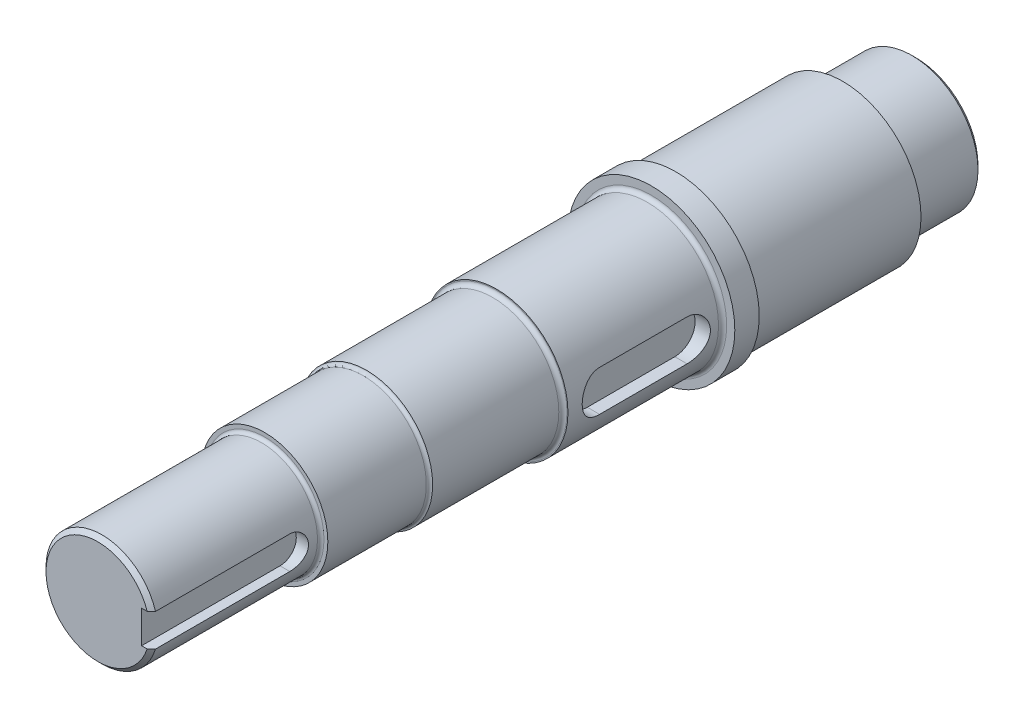
ISO-10303-21;
HEADER;
FILE_DESCRIPTION(('STEP AP214'),'2;1');
FILE_NAME('part.step','',(''),(''),'','','');
FILE_SCHEMA(('AUTOMOTIVE_DESIGN { 1 0 10303 214 1 1 1 1 }'));
ENDSEC;
DATA;
#1=APPLICATION_CONTEXT('core data for automotive mechanical design processes');
#2=APPLICATION_PROTOCOL_DEFINITION('international standard','automotive_design',2000,#1);
#3=PRODUCT_CONTEXT('',#1,'mechanical');
#4=PRODUCT('Part','Part','',(#3));
#5=PRODUCT_RELATED_PRODUCT_CATEGORY('part','',(#4));
#6=PRODUCT_DEFINITION_FORMATION('','',#4);
#7=PRODUCT_DEFINITION_CONTEXT('part definition',#1,'design');
#8=PRODUCT_DEFINITION('design','',#6,#7);
#9=PRODUCT_DEFINITION_SHAPE('','',#8);
#10=(LENGTH_UNIT() NAMED_UNIT(*) SI_UNIT(.MILLI.,.METRE.));
#11=(NAMED_UNIT(*) PLANE_ANGLE_UNIT() SI_UNIT($,.RADIAN.));
#12=(NAMED_UNIT(*) SI_UNIT($,.STERADIAN.) SOLID_ANGLE_UNIT());
#13=UNCERTAINTY_MEASURE_WITH_UNIT(LENGTH_MEASURE(1.E-05),#10,'distance_accuracy_value','');
#14=(GEOMETRIC_REPRESENTATION_CONTEXT(3) GLOBAL_UNCERTAINTY_ASSIGNED_CONTEXT((#13)) GLOBAL_UNIT_ASSIGNED_CONTEXT((#10,
#11,#12)) REPRESENTATION_CONTEXT('',''));
#15=CARTESIAN_POINT('',(0.,0.,0.));
#16=DIRECTION('',(0.,0.,1.));
#17=DIRECTION('',(1.,0.,0.));
#18=AXIS2_PLACEMENT_3D('',#15,#16,#17);
#19=CARTESIAN_POINT('',(0.,0.,402.));
#20=DIRECTION('',(0.,0.,-1.));
#21=DIRECTION('',(-1.,0.,0.));
#22=AXIS2_PLACEMENT_3D('',#19,#20,#21);
#23=CYLINDRICAL_SURFACE('',#22,27.5);
#24=CARTESIAN_POINT('',(0.,0.,321.6));
#25=DIRECTION('',(0.,0.,1.));
#26=DIRECTION('',(1.,0.,0.));
#27=AXIS2_PLACEMENT_3D('',#24,#25,#26);
#28=CIRCLE('',#27,27.5);
#29=CARTESIAN_POINT('',(27.5,0.,321.6));
#30=VERTEX_POINT('',#29);
#31=EDGE_CURVE('E200',#30,#30,#28,.T.);
#32=ORIENTED_EDGE('',*,*,#31,.T.);
#33=EDGE_LOOP('',(#32));
#34=FACE_BOUND('',#33,.T.);
#35=DIRECTION('',(0.,0.,-1.));
#36=VECTOR('',#35,1.);
#37=CARTESIAN_POINT('',(26.3106442338457,-8.,402.));
#38=LINE('',#37,#36);
#39=CARTESIAN_POINT('',(26.3106442338457,-8.,400.));
#40=VERTEX_POINT('',#39);
#41=CARTESIAN_POINT('',(26.3106442338457,-8.,334.));
#42=VERTEX_POINT('',#41);
#43=EDGE_CURVE('E138',#40,#42,#38,.T.);
#44=ORIENTED_EDGE('',*,*,#43,.F.);
#45=CARTESIAN_POINT('',(0.,0.,400.));
#46=DIRECTION('',(0.,0.,1.));
#47=DIRECTION('',(1.,0.,0.));
#48=AXIS2_PLACEMENT_3D('',#45,#46,#47);
#49=CIRCLE('',#48,27.5);
#50=CARTESIAN_POINT('',(26.3106442338457,8.,400.));
#51=VERTEX_POINT('',#50);
#52=EDGE_CURVE('E216',#40,#51,#49,.F.);
#53=ORIENTED_EDGE('',*,*,#52,.T.);
#54=DIRECTION('',(0.,0.,-1.));
#55=VECTOR('',#54,1.);
#56=CARTESIAN_POINT('',(26.3106442338457,8.,402.));
#57=LINE('',#56,#55);
#58=CARTESIAN_POINT('',(26.3106442338457,8.,334.));
#59=VERTEX_POINT('',#58);
#60=EDGE_CURVE('E56',#59,#51,#57,.F.);
#61=ORIENTED_EDGE('',*,*,#60,.F.);
#62=CARTESIAN_POINT('',(26.3106442338457,-8.,334.));
#63=CARTESIAN_POINT('',(26.3106138464806,-8.00002941250953,333.780113530023));
#64=CARTESIAN_POINT('',(26.31339970325,-7.99093569772387,333.560238022543));
#65=CARTESIAN_POINT('',(26.3243821575892,-7.95471953682609,333.122158396132));
#66=CARTESIAN_POINT('',(26.3325775994905,-7.92760094142265,332.903953930281));
#67=CARTESIAN_POINT('',(26.3541315251911,-7.85563960143696,332.471295019735));
#68=CARTESIAN_POINT('',(26.3674774590875,-7.81083993332266,332.256832774078));
#69=CARTESIAN_POINT('',(26.3989164788629,-7.70391661710101,331.832626447351));
#70=CARTESIAN_POINT('',(26.4170096771374,-7.64179255882133,331.622882478118));
#71=CARTESIAN_POINT('',(26.4573947181872,-7.50077525029609,331.209657782783));
#72=CARTESIAN_POINT('',(26.4796843137982,-7.42189097222973,331.006173772021));
#73=CARTESIAN_POINT('',(26.5278301044113,-7.24792208748818,330.606605799624));
#74=CARTESIAN_POINT('',(26.5536876206464,-7.15283147638137,330.410524613738));
#75=CARTESIAN_POINT('',(26.6082392780648,-6.94715180070415,330.02703718235));
#76=CARTESIAN_POINT('',(26.63693394056,-6.83655988627862,329.839632540443));
#77=CARTESIAN_POINT('',(26.6963706560259,-6.6006504199019,329.47466776478));
#78=CARTESIAN_POINT('',(26.7271128156666,-6.47533210047653,329.297108144814));
#79=CARTESIAN_POINT('',(26.7906616850295,-6.20724750295721,328.948292516178));
#80=CARTESIAN_POINT('',(26.8235016269389,-6.06410407777576,328.77733231253));
#81=CARTESIAN_POINT('',(26.8895667993442,-5.76409444246165,328.44798812073));
#82=CARTESIAN_POINT('',(26.9227920360062,-5.60722801244494,328.289604334169));
#83=CARTESIAN_POINT('',(26.9887294799426,-5.28074002072182,327.986396684533));
#84=CARTESIAN_POINT('',(27.0214415937379,-5.11111616679036,327.841575268861));
#85=CARTESIAN_POINT('',(27.0854611714506,-4.76020963887569,327.566485768516));
#86=CARTESIAN_POINT('',(27.1167686754057,-4.57892729757147,327.436217268861));
#87=CARTESIAN_POINT('',(27.1777256203921,-4.20218325463036,327.188726974972));
#88=CARTESIAN_POINT('',(27.2073305358195,-4.00651327777907,327.071810943131));
#89=CARTESIAN_POINT('',(27.2633528032334,-3.60562548789429,326.854975372004));
#90=CARTESIAN_POINT('',(27.2897713138544,-3.4004111831897,326.755049649285));
#91=CARTESIAN_POINT('',(27.3386777186889,-2.9817950482286,326.57295513461));
#92=CARTESIAN_POINT('',(27.3611656496463,-2.76839329453297,326.490786176658));
#93=CARTESIAN_POINT('',(27.4015581404782,-2.33494709067872,326.344916381227));
#94=CARTESIAN_POINT('',(27.4194628472555,-2.11490285367977,326.281214951813));
#95=CARTESIAN_POINT('',(27.4497486455739,-1.67583141298467,326.174320701728));
#96=CARTESIAN_POINT('',(27.4622657370543,-1.45693695871633,326.130620905881));
#97=CARTESIAN_POINT('',(27.4821099190102,-1.01603367718325,326.061646295447));
#98=CARTESIAN_POINT('',(27.4894371649423,-0.794024943406811,326.036370928972));
#99=CARTESIAN_POINT('',(27.4986927278334,-0.348590871405733,326.004480312374));
#100=CARTESIAN_POINT('',(27.5006218191976,-0.125165740983334,325.997862385702));
#101=CARTESIAN_POINT('',(27.4990279887972,0.321433410377658,326.003341440773));
#102=CARTESIAN_POINT('',(27.4955051606228,0.544607435561034,326.015438101253));
#103=CARTESIAN_POINT('',(27.4832962687889,0.982297226132295,326.057584554736));
#104=CARTESIAN_POINT('',(27.4747693029177,1.19687096756625,326.087081286487));
#105=CARTESIAN_POINT('',(27.4529077240824,1.6227560331431,326.163324954252));
#106=CARTESIAN_POINT('',(27.439571499512,1.83406623887597,326.210077672957));
#107=CARTESIAN_POINT('',(27.4084500368961,2.25182822398417,326.320421157209));
#108=CARTESIAN_POINT('',(27.3906662802501,2.45828159608931,326.384006316559));
#109=CARTESIAN_POINT('',(27.351104898212,2.86510907670466,326.527537441905));
#110=CARTESIAN_POINT('',(27.3293257727297,3.06548086879904,326.607489554304));
#111=CARTESIAN_POINT('',(27.2820848729817,3.46091415190041,326.784082279367));
#112=CARTESIAN_POINT('',(27.256585763757,3.65589461195649,326.880894280446));
#113=CARTESIAN_POINT('',(27.2027387344194,4.03708759342221,327.089920967944));
#114=CARTESIAN_POINT('',(27.1743898368239,4.22329707398689,327.202140944188));
#115=CARTESIAN_POINT('',(27.1155802508097,4.58574078126313,327.441180873525));
#116=CARTESIAN_POINT('',(27.0851195612476,4.76197500257392,327.568000834522));
#117=CARTESIAN_POINT('',(27.0228653268412,5.10341760762337,327.835411189091));
#118=CARTESIAN_POINT('',(26.9910717455921,5.26862568989026,327.97600195892));
#119=CARTESIAN_POINT('',(26.9257959685715,5.59283881339115,328.275438509706));
#120=CARTESIAN_POINT('',(26.892294463267,5.75139827430257,328.434762889377));
#121=CARTESIAN_POINT('',(26.8256711887099,6.05453947809951,328.766170771782));
#122=CARTESIAN_POINT('',(26.7925493001282,6.19912572581626,328.938250130606));
#123=CARTESIAN_POINT('',(26.7275807630162,6.47350928570371,329.294236271444));
#124=CARTESIAN_POINT('',(26.6957349710469,6.60329676880381,329.478150788776));
#125=CARTESIAN_POINT('',(26.6342666832458,6.84701637082595,329.856453868015));
#126=CARTESIAN_POINT('',(26.6046433264724,6.96095464428326,330.050838323349));
#127=CARTESIAN_POINT('',(26.5482097665725,7.17319581827483,330.450775500481));
#128=CARTESIAN_POINT('',(26.5214290138552,7.27133962598136,330.656416892558));
#129=CARTESIAN_POINT('',(26.4718440062477,7.44983609545721,331.075650004004));
#130=CARTESIAN_POINT('',(26.4490381334307,7.53019599955864,331.28923844546));
#131=CARTESIAN_POINT('',(26.408136714196,7.6724046698257,331.722682470673));
#132=CARTESIAN_POINT('',(26.3900362363208,7.73427282641311,331.942531222951));
#133=CARTESIAN_POINT('',(26.3591107233259,7.83902146376046,332.386977670108));
#134=CARTESIAN_POINT('',(26.3462832482518,7.88191072724793,332.611573117868));
#135=CARTESIAN_POINT('',(26.3278154627766,7.94336457833749,333.030074003083));
#136=CARTESIAN_POINT('',(26.3213881635008,7.96460439152623,333.223556460773));
#137=CARTESIAN_POINT('',(26.312796865776,7.99291944032766,333.611354254764));
#138=CARTESIAN_POINT('',(26.3106264443285,8.00001601625351,333.805667892236));
#139=CARTESIAN_POINT('',(26.3106442338457,8.,334.));
#140=B_SPLINE_CURVE_WITH_KNOTS('',3,(#62,#63,#64,#65,#66,#67,#68,#69,#70,#71,#72,#73,#74,#75,
#76,#77,#78,#79,#80,#81,#82,#83,#84,#85,#86,#87,#88,#89,#90,#91,#92,#93,#94,#95,#96,#97,#98,#99,
#100,#101,#102,#103,#104,#105,#106,#107,#108,#109,#110,#111,#112,#113,#114,#115,#116,#117,#118,
#119,#120,#121,#122,#123,#124,#125,#126,#127,#128,#129,#130,#131,#132,#133,#134,#135,#136,#137,
#138,#139),.UNSPECIFIED.,.F.,.F.,(4,2,2,2,2,2,2,2,2,2,2,2,2,2,2,2,2,2,2,2,2,2,2,2,2,2,2,2,2,2,2,
2,2,2,2,2,2,2,4),(0.,0.659436943554249,1.31873305489974,1.97643273881433,2.63414799575148,
3.29151204385041,3.9491201763067,4.60684936645657,5.26461284971654,5.93997685054219,
6.6153516747251,7.29084813997375,7.96632533824115,8.65504200191302,9.34350747585373,
10.0319665135188,10.7204034817236,11.3902655139289,12.0601074802365,12.7298533478211,
13.3995877183439,14.0491017024096,14.6988335443704,15.348349258952,15.9981093399168,
16.6549076019858,17.311931920769,17.968956595273,18.6259992264999,19.3069904712947,
19.9877614334311,20.668981949418,21.3499371922363,22.0373719853152,22.7245263095801,
23.4109575362285,24.0970707749295,24.6807726695567,25.2635931648055),.UNSPECIFIED.);
#141=EDGE_CURVE('E11',#42,#59,#140,.T.);
#142=ORIENTED_EDGE('',*,*,#141,.F.);
#143=EDGE_LOOP('',(#44,#53,#61,#142));
#144=FACE_BOUND('',#143,.T.);
#145=ADVANCED_FACE('F35',(#34,#144),#23,.T.);
#146=CARTESIAN_POINT('',(0.,0.,402.));
#147=DIRECTION('',(0.,0.,1.));
#148=DIRECTION('',(1.,0.,0.));
#149=AXIS2_PLACEMENT_3D('',#146,#147,#148);
#150=PLANE('',#149);
#151=CARTESIAN_POINT('',(0.,0.,402.));
#152=DIRECTION('',(0.,0.,1.));
#153=DIRECTION('',(1.,0.,0.));
#154=AXIS2_PLACEMENT_3D('',#151,#152,#153);
#155=CIRCLE('',#154,25.5);
#156=CARTESIAN_POINT('',(24.2126000256065,8.,402.));
#157=VERTEX_POINT('',#156);
#158=CARTESIAN_POINT('',(24.2126000256065,-8.,402.));
#159=VERTEX_POINT('',#158);
#160=EDGE_CURVE('E136',#157,#159,#155,.T.);
#161=ORIENTED_EDGE('',*,*,#160,.T.);
#162=DIRECTION('',(-1.,0.,0.));
#163=VECTOR('',#162,1.);
#164=CARTESIAN_POINT('',(41.5,-8.,402.));
#165=LINE('',#164,#163);
#166=CARTESIAN_POINT('',(21.5,-8.,402.));
#167=VERTEX_POINT('',#166);
#168=EDGE_CURVE('E115',#159,#167,#165,.T.);
#169=ORIENTED_EDGE('',*,*,#168,.T.);
#170=DIRECTION('',(0.,-1.,0.));
#171=VECTOR('',#170,1.);
#172=CARTESIAN_POINT('',(21.5,8.,402.));
#173=LINE('',#172,#171);
#174=CARTESIAN_POINT('',(21.5,8.,402.));
#175=VERTEX_POINT('',#174);
#176=EDGE_CURVE('E123',#175,#167,#173,.T.);
#177=ORIENTED_EDGE('',*,*,#176,.F.);
#178=DIRECTION('',(-1.,0.,0.));
#179=VECTOR('',#178,1.);
#180=CARTESIAN_POINT('',(41.5,8.,402.));
#181=LINE('',#180,#179);
#182=EDGE_CURVE('E538',#157,#175,#181,.T.);
#183=ORIENTED_EDGE('',*,*,#182,.F.);
#184=EDGE_LOOP('',(#161,#169,#177,#183));
#185=FACE_BOUND('',#184,.T.);
#186=ADVANCED_FACE('F134',(#185),#150,.T.);
#187=CARTESIAN_POINT('',(0.,0.,402.));
#188=DIRECTION('',(0.,0.,-1.));
#189=DIRECTION('',(-1.,0.,0.));
#190=AXIS2_PLACEMENT_3D('',#187,#188,#189);
#191=CONICAL_SURFACE('',#190,25.5,0.785398163397456);
#192=ORIENTED_EDGE('',*,*,#52,.F.);
#193=CARTESIAN_POINT('',(33.3671582790104,-8.,393.187214458507));
#194=CARTESIAN_POINT('',(32.6289731689582,-8.,393.905023681675));
#195=CARTESIAN_POINT('',(31.8901708211967,-8.,394.622199839139));
#196=CARTESIAN_POINT('',(30.4109820426465,-8.,396.054914279052));
#197=CARTESIAN_POINT('',(29.6705956141468,-8.,396.770452563865));
#198=CARTESIAN_POINT('',(28.1879636683614,-8.,398.199447634253));
#199=CARTESIAN_POINT('',(27.4457183514268,-8.,398.912904627601));
#200=CARTESIAN_POINT('',(25.9587903527949,-8.,400.337283265647));
#201=CARTESIAN_POINT('',(25.2141076587844,-8.,401.048204897498));
#202=CARTESIAN_POINT('',(23.7215576235621,-8.,402.466852287916));
#203=CARTESIAN_POINT('',(22.9736899642839,-8.,403.174577712028));
#204=CARTESIAN_POINT('',(21.4739135471543,-8.,404.585720152208));
#205=CARTESIAN_POINT('',(20.7220048451435,-8.,405.289137227525));
#206=CARTESIAN_POINT('',(19.59002320045,-8.,406.339908983927));
#207=CARTESIAN_POINT('',(19.2119886782954,-8.,406.689459671527));
#208=CARTESIAN_POINT('',(18.4543199616428,-8.,407.386820964778));
#209=CARTESIAN_POINT('',(18.0746857732718,-8.,407.734631577082));
#210=CARTESIAN_POINT('',(17.3135197020797,-8.,408.428207265642));
#211=CARTESIAN_POINT('',(16.9319877332203,-8.,408.773972247572));
#212=CARTESIAN_POINT('',(16.1666596705664,-8.,409.4629965939));
#213=CARTESIAN_POINT('',(15.7828635468322,-8.,409.80625592503));
#214=CARTESIAN_POINT('',(15.3977485584257,-8.,410.148035826786));
#215=B_SPLINE_CURVE_WITH_KNOTS('',3,(#193,#194,#195,#196,#197,#198,#199,#200,#201,#202,#203,
#204,#205,#206,#207,#208,#209,#210,#211,#212,#213,#214),.UNSPECIFIED.,.F.,.F.,(4,2,2,2,2,2,2,2,
2,2,4),(0.,3.08893422763165,6.1778639948091,9.26647405132007,12.3550997351188,15.4440414569155,
18.5329406037415,20.0775598517867,21.6221731889174,23.1668572031982,24.7115616894057),.UNSPECIFIED.);
#216=EDGE_CURVE('E49',#40,#159,#215,.T.);
#217=ORIENTED_EDGE('',*,*,#216,.T.);
#218=ORIENTED_EDGE('',*,*,#160,.F.);
#219=CARTESIAN_POINT('',(15.3977485584257,8.,410.148035826786));
#220=CARTESIAN_POINT('',(15.7828635468322,8.,409.80625592503));
#221=CARTESIAN_POINT('',(16.1666596705664,8.,409.4629965939));
#222=CARTESIAN_POINT('',(16.9319877332202,8.,408.773972247572));
#223=CARTESIAN_POINT('',(17.3135197020797,8.,408.428207265643));
#224=CARTESIAN_POINT('',(18.0746857732718,8.,407.734631577082));
#225=CARTESIAN_POINT('',(18.4543199616428,8.,407.386820964778));
#226=CARTESIAN_POINT('',(19.2119886782954,8.,406.689459671527));
#227=CARTESIAN_POINT('',(19.5900232004499,8.,406.339908983927));
#228=CARTESIAN_POINT('',(20.7220048451435,8.,405.289137227525));
#229=CARTESIAN_POINT('',(21.4739135471543,8.,404.585720152208));
#230=CARTESIAN_POINT('',(22.9736899642839,8.,403.174577712028));
#231=CARTESIAN_POINT('',(23.7215576235621,8.,402.466852287916));
#232=CARTESIAN_POINT('',(25.2141076587844,8.,401.048204897498));
#233=CARTESIAN_POINT('',(25.9587903527949,8.,400.337283265647));
#234=CARTESIAN_POINT('',(27.4457183514268,8.,398.912904627601));
#235=CARTESIAN_POINT('',(28.1879636683614,8.,398.199447634253));
#236=CARTESIAN_POINT('',(29.6705956141468,8.,396.770452563865));
#237=CARTESIAN_POINT('',(30.4109820426465,8.,396.054914279052));
#238=CARTESIAN_POINT('',(31.8901708211967,8.,394.622199839139));
#239=CARTESIAN_POINT('',(32.6289731689582,8.,393.905023681675));
#240=CARTESIAN_POINT('',(33.3671582790104,8.,393.187214458507));
#241=B_SPLINE_CURVE_WITH_KNOTS('',3,(#219,#220,#221,#222,#223,#224,#225,#226,#227,#228,#229,
#230,#231,#232,#233,#234,#235,#236,#237,#238,#239,#240),.UNSPECIFIED.,.F.,.F.,(4,2,2,2,2,2,2,2,
2,2,4),(0.,1.54470448620738,3.0893885004882,4.63400183761899,6.17862108566409,9.26752023249018,
12.3564619542868,15.4450876380857,18.5336976945966,21.622627461774,24.7115616894057),.UNSPECIFIED.);
#242=EDGE_CURVE('E257',#157,#51,#241,.T.);
#243=ORIENTED_EDGE('',*,*,#242,.T.);
#244=EDGE_LOOP('',(#192,#217,#218,#243));
#245=FACE_BOUND('',#244,.T.);
#246=ADVANCED_FACE('F37',(#245),#191,.T.);
#247=CARTESIAN_POINT('',(0.,0.,206.));
#248=DIRECTION('',(0.,0.,-1.));
#249=DIRECTION('',(-1.,0.,0.));
#250=AXIS2_PLACEMENT_3D('',#247,#248,#249);
#251=CYLINDRICAL_SURFACE('',#250,35.);
#252=CARTESIAN_POINT('',(0.,0.,206.));
#253=DIRECTION('',(0.,0.,1.));
#254=DIRECTION('',(1.,0.,0.));
#255=AXIS2_PLACEMENT_3D('',#252,#253,#254);
#256=CIRCLE('',#255,35.);
#257=CARTESIAN_POINT('',(35.,0.,206.));
#258=VERTEX_POINT('',#257);
#259=EDGE_CURVE('E170',#258,#258,#256,.T.);
#260=ORIENTED_EDGE('',*,*,#259,.F.);
#261=EDGE_LOOP('',(#260));
#262=FACE_BOUND('',#261,.T.);
#263=CARTESIAN_POINT('',(0.,0.,132.));
#264=DIRECTION('',(0.,0.,1.));
#265=DIRECTION('',(1.,0.,0.));
#266=AXIS2_PLACEMENT_3D('',#263,#264,#265);
#267=CIRCLE('',#266,35.);
#268=CARTESIAN_POINT('',(35.,0.,132.));
#269=VERTEX_POINT('',#268);
#270=EDGE_CURVE('E194',#269,#269,#267,.T.);
#271=ORIENTED_EDGE('',*,*,#270,.T.);
#272=EDGE_LOOP('',(#271));
#273=FACE_BOUND('',#272,.T.);
#274=CARTESIAN_POINT('',(33.5410196624969,10.,189.));
#275=CARTESIAN_POINT('',(33.54098247272,10.0000365360893,189.275087218991));
#276=CARTESIAN_POINT('',(33.5444026068777,9.98865070675198,189.550161086631));
#277=CARTESIAN_POINT('',(33.55788623849,9.94330432826118,190.098222536011));
#278=CARTESIAN_POINT('',(33.5679483583608,9.90934846024636,190.371210538497));
#279=CARTESIAN_POINT('',(33.594413604027,9.81923831824626,190.912516593966));
#280=CARTESIAN_POINT('',(33.6108017015027,9.76313664788186,191.180844151566));
#281=CARTESIAN_POINT('',(33.6494095200446,9.62923263708805,191.711600382103));
#282=CARTESIAN_POINT('',(33.6716293712015,9.55142981256278,191.974028923308));
#283=CARTESIAN_POINT('',(33.7212290569955,9.37481209906698,192.49105940669));
#284=CARTESIAN_POINT('',(33.7486062865157,9.27600781522333,192.745665225122));
#285=CARTESIAN_POINT('',(33.8077446180219,9.05809844793719,193.245614243321));
#286=CARTESIAN_POINT('',(33.8395073431819,8.93898584406153,193.490953970474));
#287=CARTESIAN_POINT('',(33.9065191207983,8.68134043949088,193.970763720506));
#288=CARTESIAN_POINT('',(33.9417687454718,8.54280444976227,194.205231950015));
#289=CARTESIAN_POINT('',(34.0147841313154,8.24727956170075,194.661831999763));
#290=CARTESIAN_POINT('',(34.0525500209621,8.09028972082816,194.883963189026));
#291=CARTESIAN_POINT('',(34.1305798802948,7.75460900510779,195.320103075119));
#292=CARTESIAN_POINT('',(34.17088316088,7.5754627690098,195.533754390697));
#293=CARTESIAN_POINT('',(34.2519587918208,7.20001350476826,195.945314601006));
#294=CARTESIAN_POINT('',(34.2927311488189,7.00371023340689,196.143223272493));
#295=CARTESIAN_POINT('',(34.3736408909465,6.59516291750775,196.522063940254));
#296=CARTESIAN_POINT('',(34.4137781606715,6.38291601516098,196.702992879867));
#297=CARTESIAN_POINT('',(34.4923217776482,5.94385936590823,197.046629614172));
#298=CARTESIAN_POINT('',(34.5307281739127,5.71705003180524,197.209337925007));
#299=CARTESIAN_POINT('',(34.6054699464445,5.24589340555308,197.518300842206));
#300=CARTESIAN_POINT('',(34.6417525803369,5.00129596788592,197.664187116516));
#301=CARTESIAN_POINT('',(34.7104015648878,4.50021525068414,197.934712979143));
#302=CARTESIAN_POINT('',(34.7427694321742,4.24373662766712,198.059360803192));
#303=CARTESIAN_POINT('',(34.8026802322956,3.72058575986786,198.286471663879));
#304=CARTESIAN_POINT('',(34.8302231298386,3.45391344054173,198.388934538248));
#305=CARTESIAN_POINT('',(34.8796844486166,2.91230878338614,198.570791583086));
#306=CARTESIAN_POINT('',(34.9016030433665,2.63737670067015,198.650186465233));
#307=CARTESIAN_POINT('',(34.9386824573288,2.088570177379,198.783430843011));
#308=CARTESIAN_POINT('',(34.9540046534084,1.81485525332598,198.837892722128));
#309=CARTESIAN_POINT('',(34.9782725964626,1.2635532068249,198.923772221713));
#310=CARTESIAN_POINT('',(34.9872184437524,0.985966145364853,198.955190204717));
#311=CARTESIAN_POINT('',(34.9984783115281,0.429042577413926,198.994690755232));
#312=CARTESIAN_POINT('',(35.0007932895185,0.149706329346249,199.002776691916));
#313=CARTESIAN_POINT('',(34.99872781944,-0.408635888537312,198.995547124931));
#314=CARTESIAN_POINT('',(34.9943474819159,-0.687641863730137,198.98023200763));
#315=CARTESIAN_POINT('',(34.979239676817,-1.23515924205468,198.927125950851));
#316=CARTESIAN_POINT('',(34.9686997350484,-1.503740537151,198.889998894474));
#317=CARTESIAN_POINT('',(34.9417087498089,-2.03670936087621,198.794137218641));
#318=CARTESIAN_POINT('',(34.9252578403383,-2.30109698443278,198.735403089012));
#319=CARTESIAN_POINT('',(34.8868841581542,-2.82382541600096,198.596828297775));
#320=CARTESIAN_POINT('',(34.8649622424429,-3.08216716413866,198.516990941752));
#321=CARTESIAN_POINT('',(34.8162103963017,-3.59122625345116,198.336810274628));
#322=CARTESIAN_POINT('',(34.7893785934989,-3.84194064326847,198.236459138933));
#323=CARTESIAN_POINT('',(34.7312018919979,-4.33662254761107,198.014872653335));
#324=CARTESIAN_POINT('',(34.6998125025795,-4.58049139181082,197.893428790896));
#325=CARTESIAN_POINT('',(34.6335400843056,-5.05725829801619,197.631233286698));
#326=CARTESIAN_POINT('',(34.5986555043474,-5.29015142117991,197.490473062352));
#327=CARTESIAN_POINT('',(34.5262997215508,-5.74345927995586,197.190637059534));
#328=CARTESIAN_POINT('',(34.4888281020536,-5.96387199506769,197.031558327985));
#329=CARTESIAN_POINT('',(34.4122822535693,-6.39076242941755,196.696219908203));
#330=CARTESIAN_POINT('',(34.373208687104,-6.59724581781993,196.519967281927));
#331=CARTESIAN_POINT('',(34.2930504133064,-7.00219950736256,196.144792481781));
#332=CARTESIAN_POINT('',(34.2519435020112,-7.20012664060527,195.945288342202));
#333=CARTESIAN_POINT('',(34.1702230234806,-7.57847708088304,195.530351607355));
#334=CARTESIAN_POINT('',(34.1296092995716,-7.75890608103356,195.31492423327));
#335=CARTESIAN_POINT('',(34.0499816296953,-8.10121311351374,194.869353305942));
#336=CARTESIAN_POINT('',(34.0109684596198,-8.26308221533717,194.639202750601));
#337=CARTESIAN_POINT('',(33.935682173311,-8.56702972033076,194.165765191648));
#338=CARTESIAN_POINT('',(33.8994089741285,-8.70910872273119,193.922478586095));
#339=CARTESIAN_POINT('',(33.8303722143045,-8.9735591116493,193.422213172047));
#340=CARTESIAN_POINT('',(33.7976414958782,-9.09575063013379,193.165134658013));
#341=CARTESIAN_POINT('',(33.7370601860415,-9.31794179575968,192.641012358617));
#342=CARTESIAN_POINT('',(33.7092093502798,-9.41794255412979,192.373969073036));
#343=CARTESIAN_POINT('',(33.6592997079518,-9.59478968632395,191.832157970268));
#344=CARTESIAN_POINT('',(33.6372338320702,-9.67166433773742,191.557400039603));
#345=CARTESIAN_POINT('',(33.5995731264667,-9.80169669852145,191.002008910573));
#346=CARTESIAN_POINT('',(33.5839752989599,-9.85486539589321,190.721378497459));
#347=CARTESIAN_POINT('',(33.5616603042316,-9.93057481078496,190.200669771156));
#348=CARTESIAN_POINT('',(33.553933788227,-9.95661201264007,189.961136740334));
#349=CARTESIAN_POINT('',(33.5436069779552,-9.99132081128702,189.481075410578));
#350=CARTESIAN_POINT('',(33.5409988653378,-10.0000188938676,189.240549192864));
#351=CARTESIAN_POINT('',(33.5410196624969,-10.,189.));
#352=B_SPLINE_CURVE_WITH_KNOTS('',3,(#274,#275,#276,#277,#278,#279,#280,#281,#282,#283,#284,
#285,#286,#287,#288,#289,#290,#291,#292,#293,#294,#295,#296,#297,#298,#299,#300,#301,#302,#303,
#304,#305,#306,#307,#308,#309,#310,#311,#312,#313,#314,#315,#316,#317,#318,#319,#320,#321,#322,
#323,#324,#325,#326,#327,#328,#329,#330,#331,#332,#333,#334,#335,#336,#337,#338,#339,#340,#341,
#342,#343,#344,#345,#346,#347,#348,#349,#350,#351),.UNSPECIFIED.,.F.,.F.,(4,2,2,2,2,2,2,2,2,2,2,
2,2,2,2,2,2,2,2,2,2,2,2,2,2,2,2,2,2,2,2,2,2,2,2,2,2,2,4),(0.,0.824984357624054,1.64979766274564,
2.47266343965469,3.29554757401041,4.11801715879569,4.94079197884898,5.76370204493683,
6.58665415984561,7.43083682322432,8.27503145566179,9.11937776812351,9.96370015635821,
10.8239516934824,11.6838688839443,12.5437923639629,13.4036893113833,14.2411536565694,
15.0786048261527,15.9159350607945,16.7532514706184,17.5663142232641,18.379358545133,
19.1922755880901,20.0055032833981,20.8272825171044,21.6494280707064,22.4717063462234,
23.2936479140539,24.1447133665263,24.995500984547,25.8466962750067,26.6978657862674,
27.5563505279373,28.4147922702562,29.2721800407936,30.1291699873618,30.8517080106868,
31.5731414970245),.UNSPECIFIED.);
#353=CARTESIAN_POINT('',(33.5410196624969,10.,189.));
#354=VERTEX_POINT('',#353);
#355=CARTESIAN_POINT('',(33.5410196624969,-10.,189.));
#356=VERTEX_POINT('',#355);
#357=EDGE_CURVE('E252',#354,#356,#352,.T.);
#358=ORIENTED_EDGE('',*,*,#357,.F.);
#359=DIRECTION('',(0.,0.,-1.));
#360=VECTOR('',#359,1.);
#361=CARTESIAN_POINT('',(33.5410196624969,10.,206.));
#362=LINE('',#361,#360);
#363=CARTESIAN_POINT('',(33.5410196624969,10.,146.));
#364=VERTEX_POINT('',#363);
#365=EDGE_CURVE('E219',#364,#354,#362,.F.);
#366=ORIENTED_EDGE('',*,*,#365,.F.);
#367=CARTESIAN_POINT('',(33.5410196624969,-10.,146.));
#368=CARTESIAN_POINT('',(33.54098247272,-10.0000365360893,145.724912781009));
#369=CARTESIAN_POINT('',(33.5444026068777,-9.98865070675198,145.449838913369));
#370=CARTESIAN_POINT('',(33.55788623849,-9.94330432826118,144.901777463989));
#371=CARTESIAN_POINT('',(33.5679483583608,-9.90934846024636,144.628789461503));
#372=CARTESIAN_POINT('',(33.594413604027,-9.81923831824626,144.087483406035));
#373=CARTESIAN_POINT('',(33.6108017015027,-9.76313664788186,143.819155848434));
#374=CARTESIAN_POINT('',(33.6494095200446,-9.62923263708805,143.288399617897));
#375=CARTESIAN_POINT('',(33.6716293712015,-9.55142981256278,143.025971076692));
#376=CARTESIAN_POINT('',(33.7212290569955,-9.37481209906698,142.50894059331));
#377=CARTESIAN_POINT('',(33.7486062865157,-9.27600781522333,142.254334774878));
#378=CARTESIAN_POINT('',(33.8077446180219,-9.05809844793719,141.754385756679));
#379=CARTESIAN_POINT('',(33.8395073431819,-8.93898584406153,141.509046029526));
#380=CARTESIAN_POINT('',(33.9065191207983,-8.68134043949088,141.029236279494));
#381=CARTESIAN_POINT('',(33.9417687454718,-8.54280444976227,140.794768049985));
#382=CARTESIAN_POINT('',(34.0147841313154,-8.24727956170075,140.338168000237));
#383=CARTESIAN_POINT('',(34.0525500209621,-8.09028972082816,140.116036810974));
#384=CARTESIAN_POINT('',(34.1305798802948,-7.75460900510779,139.679896924881));
#385=CARTESIAN_POINT('',(34.17088316088,-7.5754627690098,139.466245609303));
#386=CARTESIAN_POINT('',(34.2519587918208,-7.20001350476826,139.054685398994));
#387=CARTESIAN_POINT('',(34.2927311488189,-7.00371023340689,138.856776727507));
#388=CARTESIAN_POINT('',(34.3736408909465,-6.59516291750775,138.477936059746));
#389=CARTESIAN_POINT('',(34.4137781606715,-6.38291601516098,138.297007120133));
#390=CARTESIAN_POINT('',(34.4923217776482,-5.94385936590823,137.953370385828));
#391=CARTESIAN_POINT('',(34.5307281739127,-5.71705003180524,137.790662074993));
#392=CARTESIAN_POINT('',(34.6054699464445,-5.24589340555308,137.481699157794));
#393=CARTESIAN_POINT('',(34.6417525803369,-5.00129596788593,137.335812883484));
#394=CARTESIAN_POINT('',(34.7104015648878,-4.50021525068415,137.065287020857));
#395=CARTESIAN_POINT('',(34.7427694321742,-4.24373662766713,136.940639196808));
#396=CARTESIAN_POINT('',(34.8026802322956,-3.72058575986785,136.713528336121));
#397=CARTESIAN_POINT('',(34.8302231298386,-3.45391344054172,136.611065461752));
#398=CARTESIAN_POINT('',(34.8796844486166,-2.91230878338613,136.429208416914));
#399=CARTESIAN_POINT('',(34.9016030433665,-2.63737670067014,136.349813534767));
#400=CARTESIAN_POINT('',(34.9386824573288,-2.088570177379,136.21656915699));
#401=CARTESIAN_POINT('',(34.9540046534084,-1.81485525332598,136.162107277872));
#402=CARTESIAN_POINT('',(34.9782725964626,-1.26355320682489,136.076227778287));
#403=CARTESIAN_POINT('',(34.9872184437524,-0.98596614536485,136.044809795283));
#404=CARTESIAN_POINT('',(34.9984783115281,-0.429042577413923,136.005309244768));
#405=CARTESIAN_POINT('',(35.0007932895185,-0.149706329346247,135.997223308084));
#406=CARTESIAN_POINT('',(34.99872781944,0.408635888537312,136.004452875069));
#407=CARTESIAN_POINT('',(34.9943474819159,0.687641863730137,136.01976799237));
#408=CARTESIAN_POINT('',(34.979239676817,1.23515924205468,136.072874049149));
#409=CARTESIAN_POINT('',(34.9686997350484,1.503740537151,136.110001105526));
#410=CARTESIAN_POINT('',(34.9417087498089,2.03670936087621,136.205862781359));
#411=CARTESIAN_POINT('',(34.9252578403383,2.30109698443278,136.264596910988));
#412=CARTESIAN_POINT('',(34.8868841581542,2.82382541600097,136.403171702225));
#413=CARTESIAN_POINT('',(34.8649622424429,3.08216716413867,136.483009058248));
#414=CARTESIAN_POINT('',(34.8162103963017,3.59122625345117,136.663189725372));
#415=CARTESIAN_POINT('',(34.7893785934989,3.84194064326847,136.763540861067));
#416=CARTESIAN_POINT('',(34.7312018919979,4.33662254761107,136.985127346665));
#417=CARTESIAN_POINT('',(34.6998125025795,4.58049139181083,137.106571209104));
#418=CARTESIAN_POINT('',(34.6335400843056,5.0572582980162,137.368766713302));
#419=CARTESIAN_POINT('',(34.5986555043474,5.29015142117992,137.509526937648));
#420=CARTESIAN_POINT('',(34.5262997215508,5.74345927995586,137.809362940466));
#421=CARTESIAN_POINT('',(34.4888281020536,5.96387199506769,137.968441672015));
#422=CARTESIAN_POINT('',(34.4122822535693,6.39076242941755,138.303780091797));
#423=CARTESIAN_POINT('',(34.373208687104,6.59724581781993,138.480032718073));
#424=CARTESIAN_POINT('',(34.2930504133064,7.00219950736256,138.855207518219));
#425=CARTESIAN_POINT('',(34.2519435020112,7.20012664060527,139.054711657798));
#426=CARTESIAN_POINT('',(34.1702230234806,7.57847708088304,139.469648392645));
#427=CARTESIAN_POINT('',(34.1296092995716,7.75890608103356,139.68507576673));
#428=CARTESIAN_POINT('',(34.0499816296953,8.10121311351374,140.130646694058));
#429=CARTESIAN_POINT('',(34.0109684596198,8.26308221533717,140.360797249399));
#430=CARTESIAN_POINT('',(33.935682173311,8.56702972033076,140.834234808352));
#431=CARTESIAN_POINT('',(33.8994089741285,8.70910872273119,141.077521413905));
#432=CARTESIAN_POINT('',(33.8303722143045,8.9735591116493,141.577786827954));
#433=CARTESIAN_POINT('',(33.7976414958782,9.09575063013379,141.834865341987));
#434=CARTESIAN_POINT('',(33.7370601860415,9.31794179575968,142.358987641383));
#435=CARTESIAN_POINT('',(33.7092093502798,9.41794255412979,142.626030926964));
#436=CARTESIAN_POINT('',(33.6592997079518,9.59478968632395,143.167842029732));
#437=CARTESIAN_POINT('',(33.6372338320702,9.67166433773742,143.442599960397));
#438=CARTESIAN_POINT('',(33.5995731264667,9.80169669852145,143.997991089427));
#439=CARTESIAN_POINT('',(33.5839752989599,9.85486539589321,144.278621502541));
#440=CARTESIAN_POINT('',(33.5616603042316,9.93057481078496,144.799330228844));
#441=CARTESIAN_POINT('',(33.553933788227,9.95661201264007,145.038863259666));
#442=CARTESIAN_POINT('',(33.5436069779552,9.99132081128702,145.518924589422));
#443=CARTESIAN_POINT('',(33.5409988653378,10.0000188938676,145.759450807136));
#444=CARTESIAN_POINT('',(33.5410196624969,10.,146.));
#445=B_SPLINE_CURVE_WITH_KNOTS('',3,(#367,#368,#369,#370,#371,#372,#373,#374,#375,#376,#377,
#378,#379,#380,#381,#382,#383,#384,#385,#386,#387,#388,#389,#390,#391,#392,#393,#394,#395,#396,
#397,#398,#399,#400,#401,#402,#403,#404,#405,#406,#407,#408,#409,#410,#411,#412,#413,#414,#415,
#416,#417,#418,#419,#420,#421,#422,#423,#424,#425,#426,#427,#428,#429,#430,#431,#432,#433,#434,
#435,#436,#437,#438,#439,#440,#441,#442,#443,#444),.UNSPECIFIED.,.F.,.F.,(4,2,2,2,2,2,2,2,2,2,2,
2,2,2,2,2,2,2,2,2,2,2,2,2,2,2,2,2,2,2,2,2,2,2,2,2,2,2,4),(0.,0.824984357624054,1.64979766274564,
2.47266343965469,3.29554757401041,4.11801715879569,4.94079197884898,5.76370204493683,
6.58665415984561,7.43083682322432,8.27503145566179,9.11937776812351,9.96370015635821,
10.8239516934824,11.6838688839443,12.5437923639629,13.4036893113833,14.2411536565694,
15.0786048261527,15.9159350607945,16.7532514706184,17.5663142232641,18.379358545133,
19.1922755880901,20.0055032833981,20.8272825171044,21.6494280707064,22.4717063462234,
23.2936479140539,24.1447133665263,24.995500984547,25.8466962750067,26.6978657862674,
27.5563505279374,28.4147922702562,29.2721800407936,30.1291699873618,30.8517080106868,
31.5731414970245),.UNSPECIFIED.);
#446=CARTESIAN_POINT('',(33.5410196624969,-10.,146.));
#447=VERTEX_POINT('',#446);
#448=EDGE_CURVE('E221',#447,#364,#445,.T.);
#449=ORIENTED_EDGE('',*,*,#448,.F.);
#450=DIRECTION('',(0.,0.,-1.));
#451=VECTOR('',#450,1.);
#452=CARTESIAN_POINT('',(33.5410196624969,-10.,206.));
#453=LINE('',#452,#451);
#454=EDGE_CURVE('E228',#356,#447,#453,.T.);
#455=ORIENTED_EDGE('',*,*,#454,.F.);
#456=EDGE_LOOP('',(#358,#366,#449,#455));
#457=FACE_BOUND('',#456,.T.);
#458=ADVANCED_FACE('F230',(#262,#273,#457),#251,.T.);
#459=CARTESIAN_POINT('',(0.,0.,320.));
#460=DIRECTION('',(0.,0.,1.));
#461=DIRECTION('',(1.,0.,0.));
#462=AXIS2_PLACEMENT_3D('',#459,#460,#461);
#463=PLANE('',#462);
#464=CARTESIAN_POINT('',(0.,0.,320.));
#465=DIRECTION('',(0.,0.,1.));
#466=DIRECTION('',(1.,0.,0.));
#467=AXIS2_PLACEMENT_3D('',#464,#465,#466);
#468=CIRCLE('',#467,29.1);
#469=CARTESIAN_POINT('',(29.1,0.,320.));
#470=VERTEX_POINT('',#469);
#471=EDGE_CURVE('E203',#470,#470,#468,.F.);
#472=ORIENTED_EDGE('',*,*,#471,.T.);
#473=EDGE_LOOP('',(#472));
#474=FACE_BOUND('',#473,.T.);
#475=CARTESIAN_POINT('',(0.,0.,320.));
#476=DIRECTION('',(0.,0.,1.));
#477=DIRECTION('',(1.,0.,0.));
#478=AXIS2_PLACEMENT_3D('',#475,#476,#477);
#479=CIRCLE('',#478,31.);
#480=CARTESIAN_POINT('',(31.,0.,320.));
#481=VERTEX_POINT('',#480);
#482=EDGE_CURVE('E164',#481,#481,#479,.T.);
#483=ORIENTED_EDGE('',*,*,#482,.T.);
#484=EDGE_LOOP('',(#483));
#485=FACE_BOUND('',#484,.T.);
#486=ADVANCED_FACE('F291',(#474,#485),#463,.T.);
#487=CARTESIAN_POINT('',(0.,0.,206.));
#488=DIRECTION('',(0.,0.,1.));
#489=DIRECTION('',(1.,0.,0.));
#490=AXIS2_PLACEMENT_3D('',#487,#488,#489);
#491=PLANE('',#490);
#492=CARTESIAN_POINT('',(0.,0.,206.));
#493=DIRECTION('',(0.,0.,1.));
#494=DIRECTION('',(1.,0.,0.));
#495=AXIS2_PLACEMENT_3D('',#492,#493,#494);
#496=CIRCLE('',#495,34.5);
#497=CARTESIAN_POINT('',(34.5,0.,206.));
#498=VERTEX_POINT('',#497);
#499=EDGE_CURVE('E191',#498,#498,#496,.F.);
#500=ORIENTED_EDGE('',*,*,#499,.T.);
#501=EDGE_LOOP('',(#500));
#502=FACE_BOUND('',#501,.T.);
#503=ORIENTED_EDGE('',*,*,#259,.T.);
#504=EDGE_LOOP('',(#503));
#505=FACE_BOUND('',#504,.T.);
#506=ADVANCED_FACE('F294',(#502,#505),#491,.T.);
#507=CARTESIAN_POINT('',(0.,0.,130.));
#508=DIRECTION('',(0.,0.,1.));
#509=DIRECTION('',(1.,0.,0.));
#510=AXIS2_PLACEMENT_3D('',#507,#508,#509);
#511=PLANE('',#510);
#512=CARTESIAN_POINT('',(0.,0.,130.));
#513=DIRECTION('',(0.,0.,1.));
#514=DIRECTION('',(1.,0.,0.));
#515=AXIS2_PLACEMENT_3D('',#512,#513,#514);
#516=CIRCLE('',#515,37.);
#517=CARTESIAN_POINT('',(37.,0.,130.));
#518=VERTEX_POINT('',#517);
#519=EDGE_CURVE('E197',#518,#518,#516,.F.);
#520=ORIENTED_EDGE('',*,*,#519,.T.);
#521=EDGE_LOOP('',(#520));
#522=FACE_BOUND('',#521,.T.);
#523=CARTESIAN_POINT('',(0.,0.,130.));
#524=DIRECTION('',(0.,0.,1.));
#525=DIRECTION('',(1.,0.,0.));
#526=AXIS2_PLACEMENT_3D('',#523,#524,#525);
#527=CIRCLE('',#526,41.);
#528=CARTESIAN_POINT('',(41.,0.,130.));
#529=VERTEX_POINT('',#528);
#530=EDGE_CURVE('E174',#529,#529,#527,.T.);
#531=ORIENTED_EDGE('',*,*,#530,.T.);
#532=EDGE_LOOP('',(#531));
#533=FACE_BOUND('',#532,.T.);
#534=ADVANCED_FACE('F306',(#522,#533),#511,.T.);
#535=CARTESIAN_POINT('',(0.,0.,36.));
#536=DIRECTION('',(0.,0.,-1.));
#537=DIRECTION('',(-1.,0.,0.));
#538=AXIS2_PLACEMENT_3D('',#535,#536,#537);
#539=CYLINDRICAL_SURFACE('',#538,32.5);
#540=CARTESIAN_POINT('',(0.,0.,1.99999999999993));
#541=DIRECTION('',(0.,0.,1.));
#542=DIRECTION('',(1.,0.,0.));
#543=AXIS2_PLACEMENT_3D('',#540,#541,#542);
#544=CIRCLE('',#543,32.5);
#545=CARTESIAN_POINT('',(32.5,0.,1.99999999999993));
#546=VERTEX_POINT('',#545);
#547=EDGE_CURVE('E209',#546,#546,#544,.T.);
#548=ORIENTED_EDGE('',*,*,#547,.T.);
#549=EDGE_LOOP('',(#548));
#550=FACE_BOUND('',#549,.T.);
#551=CARTESIAN_POINT('',(0.,0.,36.));
#552=DIRECTION('',(0.,0.,1.));
#553=DIRECTION('',(1.,0.,0.));
#554=AXIS2_PLACEMENT_3D('',#551,#552,#553);
#555=CIRCLE('',#554,32.5);
#556=CARTESIAN_POINT('',(32.5,0.,36.));
#557=VERTEX_POINT('',#556);
#558=EDGE_CURVE('E183',#557,#557,#555,.T.);
#559=ORIENTED_EDGE('',*,*,#558,.F.);
#560=EDGE_LOOP('',(#559));
#561=FACE_BOUND('',#560,.T.);
#562=ADVANCED_FACE('F312',(#550,#561),#539,.T.);
#563=CARTESIAN_POINT('',(0.,0.,0.));
#564=DIRECTION('',(0.,0.,1.));
#565=DIRECTION('',(1.,0.,0.));
#566=AXIS2_PLACEMENT_3D('',#563,#564,#565);
#567=PLANE('',#566);
#568=CARTESIAN_POINT('',(0.,0.,0.));
#569=DIRECTION('',(0.,0.,1.));
#570=DIRECTION('',(1.,0.,0.));
#571=AXIS2_PLACEMENT_3D('',#568,#569,#570);
#572=CIRCLE('',#571,30.5000000000001);
#573=CARTESIAN_POINT('',(30.5000000000001,0.,0.));
#574=VERTEX_POINT('',#573);
#575=EDGE_CURVE('E212',#574,#574,#572,.F.);
#576=ORIENTED_EDGE('',*,*,#575,.T.);
#577=EDGE_LOOP('',(#576));
#578=FACE_BOUND('',#577,.T.);
#579=ADVANCED_FACE('F363',(#578),#567,.F.);
#580=CARTESIAN_POINT('',(0.,0.,36.));
#581=DIRECTION('',(0.,0.,1.));
#582=DIRECTION('',(1.,0.,0.));
#583=AXIS2_PLACEMENT_3D('',#580,#581,#582);
#584=PLANE('',#583);
#585=CARTESIAN_POINT('',(0.,0.,36.));
#586=DIRECTION('',(0.,0.,1.));
#587=DIRECTION('',(1.,0.,0.));
#588=AXIS2_PLACEMENT_3D('',#585,#586,#587);
#589=CIRCLE('',#588,38.5);
#590=CARTESIAN_POINT('',(38.5,0.,36.));
#591=VERTEX_POINT('',#590);
#592=EDGE_CURVE('E177',#591,#591,#589,.T.);
#593=ORIENTED_EDGE('',*,*,#592,.F.);
#594=EDGE_LOOP('',(#593));
#595=FACE_BOUND('',#594,.T.);
#596=ORIENTED_EDGE('',*,*,#558,.T.);
#597=EDGE_LOOP('',(#596));
#598=FACE_BOUND('',#597,.T.);
#599=ADVANCED_FACE('F366',(#595,#598),#584,.F.);
#600=CARTESIAN_POINT('',(0.,0.,118.));
#601=DIRECTION('',(0.,0.,-1.));
#602=DIRECTION('',(-1.,0.,0.));
#603=AXIS2_PLACEMENT_3D('',#600,#601,#602);
#604=CYLINDRICAL_SURFACE('',#603,38.5);
#605=CARTESIAN_POINT('',(0.,0.,118.));
#606=DIRECTION('',(0.,0.,1.));
#607=DIRECTION('',(1.,0.,0.));
#608=AXIS2_PLACEMENT_3D('',#605,#606,#607);
#609=CIRCLE('',#608,38.5);
#610=CARTESIAN_POINT('',(38.5,0.,118.));
#611=VERTEX_POINT('',#610);
#612=EDGE_CURVE('E180',#611,#611,#609,.T.);
#613=ORIENTED_EDGE('',*,*,#612,.F.);
#614=EDGE_LOOP('',(#613));
#615=FACE_BOUND('',#614,.T.);
#616=ORIENTED_EDGE('',*,*,#592,.T.);
#617=EDGE_LOOP('',(#616));
#618=FACE_BOUND('',#617,.T.);
#619=ADVANCED_FACE('F368',(#615,#618),#604,.T.);
#620=CARTESIAN_POINT('',(0.,0.,118.));
#621=DIRECTION('',(0.,0.,1.));
#622=DIRECTION('',(1.,0.,0.));
#623=AXIS2_PLACEMENT_3D('',#620,#621,#622);
#624=PLANE('',#623);
#625=CARTESIAN_POINT('',(0.,0.,118.));
#626=DIRECTION('',(0.,0.,1.));
#627=DIRECTION('',(1.,0.,0.));
#628=AXIS2_PLACEMENT_3D('',#625,#626,#627);
#629=CIRCLE('',#628,41.);
#630=CARTESIAN_POINT('',(41.,0.,118.));
#631=VERTEX_POINT('',#630);
#632=EDGE_CURVE('E173',#631,#631,#629,.T.);
#633=ORIENTED_EDGE('',*,*,#632,.F.);
#634=EDGE_LOOP('',(#633));
#635=FACE_BOUND('',#634,.T.);
#636=ORIENTED_EDGE('',*,*,#612,.T.);
#637=EDGE_LOOP('',(#636));
#638=FACE_BOUND('',#637,.T.);
#639=ADVANCED_FACE('F375',(#635,#638),#624,.F.);
#640=CARTESIAN_POINT('',(0.,0.,130.));
#641=DIRECTION('',(0.,0.,-1.));
#642=DIRECTION('',(-1.,0.,0.));
#643=AXIS2_PLACEMENT_3D('',#640,#641,#642);
#644=CYLINDRICAL_SURFACE('',#643,41.);
#645=ORIENTED_EDGE('',*,*,#530,.F.);
#646=EDGE_LOOP('',(#645));
#647=FACE_BOUND('',#646,.T.);
#648=ORIENTED_EDGE('',*,*,#632,.T.);
#649=EDGE_LOOP('',(#648));
#650=FACE_BOUND('',#649,.T.);
#651=ADVANCED_FACE('F303',(#647,#650),#644,.T.);
#652=CARTESIAN_POINT('',(0.,0.,270.));
#653=DIRECTION('',(0.,0.,-1.));
#654=DIRECTION('',(-1.,0.,0.));
#655=AXIS2_PLACEMENT_3D('',#652,#653,#654);
#656=CYLINDRICAL_SURFACE('',#655,32.5);
#657=CARTESIAN_POINT('',(0.,0.,208.));
#658=DIRECTION('',(0.,0.,1.));
#659=DIRECTION('',(1.,0.,0.));
#660=AXIS2_PLACEMENT_3D('',#657,#658,#659);
#661=CIRCLE('',#660,32.5);
#662=CARTESIAN_POINT('',(32.5,0.,208.));
#663=VERTEX_POINT('',#662);
#664=EDGE_CURVE('E188',#663,#663,#661,.T.);
#665=ORIENTED_EDGE('',*,*,#664,.T.);
#666=EDGE_LOOP('',(#665));
#667=FACE_BOUND('',#666,.T.);
#668=CARTESIAN_POINT('',(0.,0.,270.));
#669=DIRECTION('',(0.,0.,1.));
#670=DIRECTION('',(1.,0.,0.));
#671=AXIS2_PLACEMENT_3D('',#668,#669,#670);
#672=CIRCLE('',#671,32.5);
#673=CARTESIAN_POINT('',(32.5,0.,270.));
#674=VERTEX_POINT('',#673);
#675=EDGE_CURVE('E167',#674,#674,#672,.T.);
#676=ORIENTED_EDGE('',*,*,#675,.F.);
#677=EDGE_LOOP('',(#676));
#678=FACE_BOUND('',#677,.T.);
#679=ADVANCED_FACE('F300',(#667,#678),#656,.T.);
#680=CARTESIAN_POINT('',(0.,0.,320.));
#681=DIRECTION('',(0.,0.,-1.));
#682=DIRECTION('',(-1.,0.,0.));
#683=AXIS2_PLACEMENT_3D('',#680,#681,#682);
#684=CYLINDRICAL_SURFACE('',#683,31.);
#685=CARTESIAN_POINT('',(0.,0.,271.596871942267));
#686=DIRECTION('',(0.,0.,-1.));
#687=DIRECTION('',(-1.,0.,0.));
#688=AXIS2_PLACEMENT_3D('',#685,#686,#687);
#689=CIRCLE('',#688,31.);
#690=CARTESIAN_POINT('',(-31.,0.,271.596871942267));
#691=VERTEX_POINT('',#690);
#692=EDGE_CURVE('E206',#691,#691,#689,.F.);
#693=ORIENTED_EDGE('',*,*,#692,.T.);
#694=EDGE_LOOP('',(#693));
#695=FACE_BOUND('',#694,.T.);
#696=ORIENTED_EDGE('',*,*,#482,.F.);
#697=EDGE_LOOP('',(#696));
#698=FACE_BOUND('',#697,.T.);
#699=ADVANCED_FACE('F296',(#695,#698),#684,.T.);
#700=CARTESIAN_POINT('',(0.,0.,208.));
#701=DIRECTION('',(0.,0.,1.));
#702=DIRECTION('',(1.,0.,0.));
#703=AXIS2_PLACEMENT_3D('',#700,#701,#702);
#704=TOROIDAL_SURFACE('',#703,34.5,2.);
#705=ORIENTED_EDGE('',*,*,#499,.F.);
#706=EDGE_LOOP('',(#705));
#707=FACE_BOUND('',#706,.T.);
#708=ORIENTED_EDGE('',*,*,#664,.F.);
#709=EDGE_LOOP('',(#708));
#710=FACE_BOUND('',#709,.T.);
#711=ADVANCED_FACE('F299',(#707,#710),#704,.F.);
#712=CARTESIAN_POINT('',(0.,0.,132.));
#713=DIRECTION('',(0.,0.,1.));
#714=DIRECTION('',(1.,0.,0.));
#715=AXIS2_PLACEMENT_3D('',#712,#713,#714);
#716=TOROIDAL_SURFACE('',#715,37.,2.);
#717=ORIENTED_EDGE('',*,*,#519,.F.);
#718=EDGE_LOOP('',(#717));
#719=FACE_BOUND('',#718,.T.);
#720=ORIENTED_EDGE('',*,*,#270,.F.);
#721=EDGE_LOOP('',(#720));
#722=FACE_BOUND('',#721,.T.);
#723=ADVANCED_FACE('F333',(#719,#722),#716,.F.);
#724=CARTESIAN_POINT('',(0.,0.,321.6));
#725=DIRECTION('',(0.,0.,1.));
#726=DIRECTION('',(1.,0.,0.));
#727=AXIS2_PLACEMENT_3D('',#724,#725,#726);
#728=TOROIDAL_SURFACE('',#727,29.1,1.6);
#729=ORIENTED_EDGE('',*,*,#471,.F.);
#730=EDGE_LOOP('',(#729));
#731=FACE_BOUND('',#730,.T.);
#732=ORIENTED_EDGE('',*,*,#31,.F.);
#733=EDGE_LOOP('',(#732));
#734=FACE_BOUND('',#733,.T.);
#735=ADVANCED_FACE('F335',(#731,#734),#728,.F.);
#736=CARTESIAN_POINT('',(0.,0.,271.596871942267));
#737=DIRECTION('',(0.,0.,-1.));
#738=DIRECTION('',(-1.,0.,0.));
#739=AXIS2_PLACEMENT_3D('',#736,#737,#738);
#740=TOROIDAL_SURFACE('',#739,32.6,1.6);
#741=ORIENTED_EDGE('',*,*,#675,.T.);
#742=EDGE_LOOP('',(#741));
#743=FACE_BOUND('',#742,.T.);
#744=ORIENTED_EDGE('',*,*,#692,.F.);
#745=EDGE_LOOP('',(#744));
#746=FACE_BOUND('',#745,.T.);
#747=ADVANCED_FACE('F342',(#743,#746),#740,.F.);
#748=CARTESIAN_POINT('',(0.,0.,1.99999999999993));
#749=DIRECTION('',(0.,0.,1.));
#750=DIRECTION('',(1.,0.,0.));
#751=AXIS2_PLACEMENT_3D('',#748,#749,#750);
#752=CONICAL_SURFACE('',#751,32.5,0.785398163397447);
#753=ORIENTED_EDGE('',*,*,#575,.F.);
#754=EDGE_LOOP('',(#753));
#755=FACE_BOUND('',#754,.T.);
#756=ORIENTED_EDGE('',*,*,#547,.F.);
#757=EDGE_LOOP('',(#756));
#758=FACE_BOUND('',#757,.T.);
#759=ADVANCED_FACE('F250',(#755,#758),#752,.T.);
#760=CARTESIAN_POINT('',(56.5,0.,189.));
#761=DIRECTION('',(-1.,0.,0.));
#762=DIRECTION('',(0.,0.,1.));
#763=AXIS2_PLACEMENT_3D('',#760,#761,#762);
#764=CYLINDRICAL_SURFACE('',#763,10.);
#765=ORIENTED_EDGE('',*,*,#357,.T.);
#766=DIRECTION('',(-1.,0.,0.));
#767=VECTOR('',#766,1.);
#768=CARTESIAN_POINT('',(56.5,-10.,189.));
#769=LINE('',#768,#767);
#770=CARTESIAN_POINT('',(27.5,-10.,189.));
#771=VERTEX_POINT('',#770);
#772=EDGE_CURVE('E162',#356,#771,#769,.T.);
#773=ORIENTED_EDGE('',*,*,#772,.T.);
#774=CARTESIAN_POINT('',(27.5,0.,189.));
#775=DIRECTION('',(1.,0.,0.));
#776=DIRECTION('',(0.,0.,-1.));
#777=AXIS2_PLACEMENT_3D('',#774,#775,#776);
#778=CIRCLE('',#777,10.);
#779=CARTESIAN_POINT('',(27.5,10.,189.));
#780=VERTEX_POINT('',#779);
#781=EDGE_CURVE('E145',#780,#771,#778,.T.);
#782=ORIENTED_EDGE('',*,*,#781,.F.);
#783=DIRECTION('',(-1.,0.,0.));
#784=VECTOR('',#783,1.);
#785=CARTESIAN_POINT('',(56.5,10.,189.));
#786=LINE('',#785,#784);
#787=EDGE_CURVE('E157',#354,#780,#786,.T.);
#788=ORIENTED_EDGE('',*,*,#787,.F.);
#789=EDGE_LOOP('',(#765,#773,#782,#788));
#790=FACE_BOUND('',#789,.T.);
#791=ADVANCED_FACE('F245',(#790),#764,.F.);
#792=CARTESIAN_POINT('',(56.5,-10.,189.));
#793=DIRECTION('',(0.,1.,0.));
#794=DIRECTION('',(0.,0.,1.));
#795=AXIS2_PLACEMENT_3D('',#792,#793,#794);
#796=PLANE('',#795);
#797=ORIENTED_EDGE('',*,*,#454,.T.);
#798=DIRECTION('',(-1.,0.,0.));
#799=VECTOR('',#798,1.);
#800=CARTESIAN_POINT('',(56.5,-10.,146.));
#801=LINE('',#800,#799);
#802=CARTESIAN_POINT('',(27.5,-10.,146.));
#803=VERTEX_POINT('',#802);
#804=EDGE_CURVE('E160',#447,#803,#801,.T.);
#805=ORIENTED_EDGE('',*,*,#804,.T.);
#806=DIRECTION('',(0.,0.,-1.));
#807=VECTOR('',#806,1.);
#808=CARTESIAN_POINT('',(27.5,-10.,189.));
#809=LINE('',#808,#807);
#810=EDGE_CURVE('E148',#771,#803,#809,.T.);
#811=ORIENTED_EDGE('',*,*,#810,.F.);
#812=ORIENTED_EDGE('',*,*,#772,.F.);
#813=EDGE_LOOP('',(#797,#805,#811,#812));
#814=FACE_BOUND('',#813,.T.);
#815=ADVANCED_FACE('F240',(#814),#796,.T.);
#816=CARTESIAN_POINT('',(56.5,0.,146.));
#817=DIRECTION('',(-1.,0.,0.));
#818=DIRECTION('',(0.,0.,1.));
#819=AXIS2_PLACEMENT_3D('',#816,#817,#818);
#820=CYLINDRICAL_SURFACE('',#819,10.);
#821=ORIENTED_EDGE('',*,*,#448,.T.);
#822=DIRECTION('',(-1.,0.,0.));
#823=VECTOR('',#822,1.);
#824=CARTESIAN_POINT('',(56.5,10.,146.));
#825=LINE('',#824,#823);
#826=CARTESIAN_POINT('',(27.5,10.,146.));
#827=VERTEX_POINT('',#826);
#828=EDGE_CURVE('E64',#364,#827,#825,.T.);
#829=ORIENTED_EDGE('',*,*,#828,.T.);
#830=CARTESIAN_POINT('',(27.5,0.,146.));
#831=DIRECTION('',(1.,0.,0.));
#832=DIRECTION('',(0.,0.,-1.));
#833=AXIS2_PLACEMENT_3D('',#830,#831,#832);
#834=CIRCLE('',#833,10.);
#835=EDGE_CURVE('E151',#803,#827,#834,.T.);
#836=ORIENTED_EDGE('',*,*,#835,.F.);
#837=ORIENTED_EDGE('',*,*,#804,.F.);
#838=EDGE_LOOP('',(#821,#829,#836,#837));
#839=FACE_BOUND('',#838,.T.);
#840=ADVANCED_FACE('F234',(#839),#820,.F.);
#841=CARTESIAN_POINT('',(56.5,10.,189.));
#842=DIRECTION('',(0.,-1.,0.));
#843=DIRECTION('',(0.,0.,-1.));
#844=AXIS2_PLACEMENT_3D('',#841,#842,#843);
#845=PLANE('',#844);
#846=ORIENTED_EDGE('',*,*,#365,.T.);
#847=ORIENTED_EDGE('',*,*,#787,.T.);
#848=DIRECTION('',(0.,0.,1.));
#849=VECTOR('',#848,1.);
#850=CARTESIAN_POINT('',(27.5,10.,189.));
#851=LINE('',#850,#849);
#852=EDGE_CURVE('E154',#827,#780,#851,.T.);
#853=ORIENTED_EDGE('',*,*,#852,.F.);
#854=ORIENTED_EDGE('',*,*,#828,.F.);
#855=EDGE_LOOP('',(#846,#847,#853,#854));
#856=FACE_BOUND('',#855,.T.);
#857=ADVANCED_FACE('F239',(#856),#845,.T.);
#858=CARTESIAN_POINT('',(27.5,0.,189.));
#859=DIRECTION('',(1.,0.,0.));
#860=DIRECTION('',(0.,0.,-1.));
#861=AXIS2_PLACEMENT_3D('',#858,#859,#860);
#862=PLANE('',#861);
#863=ORIENTED_EDGE('',*,*,#781,.T.);
#864=ORIENTED_EDGE('',*,*,#810,.T.);
#865=ORIENTED_EDGE('',*,*,#835,.T.);
#866=ORIENTED_EDGE('',*,*,#852,.T.);
#867=EDGE_LOOP('',(#863,#864,#865,#866));
#868=FACE_BOUND('',#867,.T.);
#869=ADVANCED_FACE('F273',(#868),#862,.T.);
#870=CARTESIAN_POINT('',(41.5,0.,334.));
#871=DIRECTION('',(-1.,0.,0.));
#872=DIRECTION('',(0.,0.,1.));
#873=AXIS2_PLACEMENT_3D('',#870,#871,#872);
#874=CYLINDRICAL_SURFACE('',#873,8.);
#875=ORIENTED_EDGE('',*,*,#141,.T.);
#876=DIRECTION('',(-1.,0.,0.));
#877=VECTOR('',#876,1.);
#878=CARTESIAN_POINT('',(41.5,8.,334.));
#879=LINE('',#878,#877);
#880=CARTESIAN_POINT('',(21.5,8.,334.));
#881=VERTEX_POINT('',#880);
#882=EDGE_CURVE('E140',#59,#881,#879,.T.);
#883=ORIENTED_EDGE('',*,*,#882,.T.);
#884=CARTESIAN_POINT('',(21.5,0.,334.));
#885=DIRECTION('',(1.,0.,0.));
#886=DIRECTION('',(0.,0.,-1.));
#887=AXIS2_PLACEMENT_3D('',#884,#885,#886);
#888=CIRCLE('',#887,8.);
#889=CARTESIAN_POINT('',(21.5,-8.,334.));
#890=VERTEX_POINT('',#889);
#891=EDGE_CURVE('E122',#890,#881,#888,.T.);
#892=ORIENTED_EDGE('',*,*,#891,.F.);
#893=DIRECTION('',(-1.,0.,0.));
#894=VECTOR('',#893,1.);
#895=CARTESIAN_POINT('',(41.5,-8.,334.));
#896=LINE('',#895,#894);
#897=EDGE_CURVE('E118',#42,#890,#896,.T.);
#898=ORIENTED_EDGE('',*,*,#897,.F.);
#899=EDGE_LOOP('',(#875,#883,#892,#898));
#900=FACE_BOUND('',#899,.T.);
#901=ADVANCED_FACE('F270',(#900),#874,.F.);
#902=CARTESIAN_POINT('',(41.5,-8.,402.));
#903=DIRECTION('',(0.,1.,0.));
#904=DIRECTION('',(0.,0.,1.));
#905=AXIS2_PLACEMENT_3D('',#902,#903,#904);
#906=PLANE('',#905);
#907=ORIENTED_EDGE('',*,*,#43,.T.);
#908=ORIENTED_EDGE('',*,*,#897,.T.);
#909=DIRECTION('',(0.,0.,-1.));
#910=VECTOR('',#909,1.);
#911=CARTESIAN_POINT('',(21.5,-8.,402.));
#912=LINE('',#911,#910);
#913=EDGE_CURVE('E111',#167,#890,#912,.T.);
#914=ORIENTED_EDGE('',*,*,#913,.F.);
#915=ORIENTED_EDGE('',*,*,#168,.F.);
#916=ORIENTED_EDGE('',*,*,#216,.F.);
#917=EDGE_LOOP('',(#907,#908,#914,#915,#916));
#918=FACE_BOUND('',#917,.T.);
#919=ADVANCED_FACE('F113',(#918),#906,.T.);
#920=CARTESIAN_POINT('',(41.5,8.,402.));
#921=DIRECTION('',(0.,-1.,0.));
#922=DIRECTION('',(0.,0.,-1.));
#923=AXIS2_PLACEMENT_3D('',#920,#921,#922);
#924=PLANE('',#923);
#925=ORIENTED_EDGE('',*,*,#60,.T.);
#926=ORIENTED_EDGE('',*,*,#242,.F.);
#927=ORIENTED_EDGE('',*,*,#182,.T.);
#928=DIRECTION('',(0.,0.,1.));
#929=VECTOR('',#928,1.);
#930=CARTESIAN_POINT('',(21.5,8.,402.));
#931=LINE('',#930,#929);
#932=EDGE_CURVE('E129',#881,#175,#931,.T.);
#933=ORIENTED_EDGE('',*,*,#932,.F.);
#934=ORIENTED_EDGE('',*,*,#882,.F.);
#935=EDGE_LOOP('',(#925,#926,#927,#933,#934));
#936=FACE_BOUND('',#935,.T.);
#937=ADVANCED_FACE('F266',(#936),#924,.T.);
#938=CARTESIAN_POINT('',(21.5,0.,334.));
#939=DIRECTION('',(1.,0.,0.));
#940=DIRECTION('',(0.,0.,-1.));
#941=AXIS2_PLACEMENT_3D('',#938,#939,#940);
#942=PLANE('',#941);
#943=ORIENTED_EDGE('',*,*,#176,.T.);
#944=ORIENTED_EDGE('',*,*,#913,.T.);
#945=ORIENTED_EDGE('',*,*,#891,.T.);
#946=ORIENTED_EDGE('',*,*,#932,.T.);
#947=EDGE_LOOP('',(#943,#944,#945,#946));
#948=FACE_BOUND('',#947,.T.);
#949=ADVANCED_FACE('F127',(#948),#942,.T.);
#950=CLOSED_SHELL('',(#145,#186,#246,#458,#486,#506,#534,#562,#579,#599,#619,#639,#651,#679,
#699,#711,#723,#735,#747,#759,#791,#815,#840,#857,#869,#901,#919,#937,#949));
#951=MANIFOLD_SOLID_BREP('B2',#950);
#952=ADVANCED_BREP_SHAPE_REPRESENTATION('',(#18,#951),#14);
#953=SHAPE_DEFINITION_REPRESENTATION(#9,#952);
ENDSEC;
END-ISO-10303-21;
